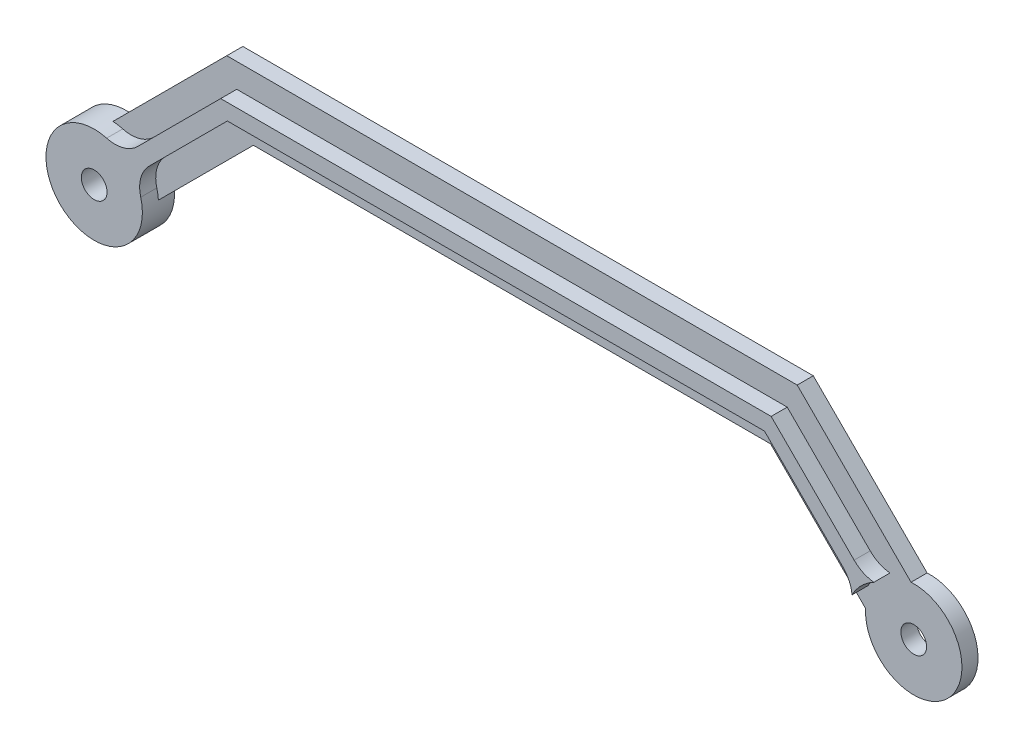
ISO-10303-21;
HEADER;
FILE_DESCRIPTION(('STEP AP214'),'2;1');
FILE_NAME('part.step','',(''),(''),'','','');
FILE_SCHEMA(('AUTOMOTIVE_DESIGN { 1 0 10303 214 1 1 1 1 }'));
ENDSEC;
DATA;
#1=APPLICATION_CONTEXT('core data for automotive mechanical design processes');
#2=APPLICATION_PROTOCOL_DEFINITION('international standard','automotive_design',2000,#1);
#3=PRODUCT_CONTEXT('',#1,'mechanical');
#4=PRODUCT('Part','Part','',(#3));
#5=PRODUCT_RELATED_PRODUCT_CATEGORY('part','',(#4));
#6=PRODUCT_DEFINITION_FORMATION('','',#4);
#7=PRODUCT_DEFINITION_CONTEXT('part definition',#1,'design');
#8=PRODUCT_DEFINITION('design','',#6,#7);
#9=PRODUCT_DEFINITION_SHAPE('','',#8);
#10=(LENGTH_UNIT() NAMED_UNIT(*) SI_UNIT(.MILLI.,.METRE.));
#11=(NAMED_UNIT(*) PLANE_ANGLE_UNIT() SI_UNIT($,.RADIAN.));
#12=(NAMED_UNIT(*) SI_UNIT($,.STERADIAN.) SOLID_ANGLE_UNIT());
#13=UNCERTAINTY_MEASURE_WITH_UNIT(LENGTH_MEASURE(1.E-05),#10,'distance_accuracy_value','');
#14=(GEOMETRIC_REPRESENTATION_CONTEXT(3) GLOBAL_UNCERTAINTY_ASSIGNED_CONTEXT((#13)) GLOBAL_UNIT_ASSIGNED_CONTEXT((#10,
#11,#12)) REPRESENTATION_CONTEXT('',''));
#15=CARTESIAN_POINT('',(0.,0.,0.));
#16=DIRECTION('',(0.,0.,1.));
#17=DIRECTION('',(1.,0.,0.));
#18=AXIS2_PLACEMENT_3D('',#15,#16,#17);
#19=CARTESIAN_POINT('',(196.015609295867,10.8129154012847,4.46390509890252));
#20=DIRECTION('',(0.,0.,-1.));
#21=DIRECTION('',(-1.,0.,0.));
#22=AXIS2_PLACEMENT_3D('',#19,#20,#21);
#23=CYLINDRICAL_SURFACE('',#22,9.);
#24=CARTESIAN_POINT('',(196.015609295867,10.8129154012847,4.46390509890252));
#25=DIRECTION('',(0.,0.,1.));
#26=DIRECTION('',(1.,0.,0.));
#27=AXIS2_PLACEMENT_3D('',#24,#25,#26);
#28=CIRCLE('',#27,9.);
#29=CARTESIAN_POINT('',(187.029552118495,11.3136912044179,4.46390509890252));
#30=VERTEX_POINT('',#29);
#31=CARTESIAN_POINT('',(195.514833492734,19.7989725786565,4.46390509890252));
#32=VERTEX_POINT('',#31);
#33=EDGE_CURVE('E331',#30,#32,#28,.T.);
#34=ORIENTED_EDGE('',*,*,#33,.F.);
#35=DIRECTION('',(0.,0.,-1.));
#36=VECTOR('',#35,1.);
#37=CARTESIAN_POINT('',(187.029552118495,11.3136912044179,4.46390509890252));
#38=LINE('',#37,#36);
#39=CARTESIAN_POINT('',(187.029552118495,11.3136912044179,1.46390509890252));
#40=VERTEX_POINT('',#39);
#41=EDGE_CURVE('E225',#30,#40,#38,.T.);
#42=ORIENTED_EDGE('',*,*,#41,.T.);
#43=CARTESIAN_POINT('',(196.015609295867,10.8129154012847,1.46390509890252));
#44=DIRECTION('',(0.,0.,1.));
#45=DIRECTION('',(-1.,0.,0.));
#46=AXIS2_PLACEMENT_3D('',#43,#44,#45);
#47=CIRCLE('',#46,9.);
#48=CARTESIAN_POINT('',(195.514833492734,19.7989725786565,1.46390509890252));
#49=VERTEX_POINT('',#48);
#50=EDGE_CURVE('E258',#40,#49,#47,.T.);
#51=ORIENTED_EDGE('',*,*,#50,.T.);
#52=DIRECTION('',(0.,0.,-1.));
#53=VECTOR('',#52,1.);
#54=CARTESIAN_POINT('',(195.514833492734,19.7989725786565,4.46390509890252));
#55=LINE('',#54,#53);
#56=EDGE_CURVE('E228',#32,#49,#55,.T.);
#57=ORIENTED_EDGE('',*,*,#56,.F.);
#58=EDGE_LOOP('',(#34,#42,#51,#57));
#59=FACE_BOUND('',#58,.T.);
#60=ADVANCED_FACE('F39',(#59),#23,.T.);
#61=CARTESIAN_POINT('',(196.015609295867,10.8129154012847,4.46390509890252));
#62=DIRECTION('',(0.,0.,-1.));
#63=DIRECTION('',(-1.,0.,0.));
#64=AXIS2_PLACEMENT_3D('',#61,#62,#63);
#65=CYLINDRICAL_SURFACE('',#64,2.4);
#66=CARTESIAN_POINT('',(196.015609295867,10.8129154012847,1.46390509890252));
#67=DIRECTION('',(0.,0.,1.));
#68=DIRECTION('',(1.,0.,0.));
#69=AXIS2_PLACEMENT_3D('',#66,#67,#68);
#70=CIRCLE('',#69,2.4);
#71=CARTESIAN_POINT('',(198.415609295867,10.8129154012847,1.46390509890252));
#72=VERTEX_POINT('',#71);
#73=EDGE_CURVE('E280',#72,#72,#70,.T.);
#74=ORIENTED_EDGE('',*,*,#73,.F.);
#75=EDGE_LOOP('',(#74));
#76=FACE_BOUND('',#75,.T.);
#77=CARTESIAN_POINT('',(196.015609295867,10.8129154012847,4.46390509890252));
#78=DIRECTION('',(0.,0.,1.));
#79=DIRECTION('',(1.,0.,0.));
#80=AXIS2_PLACEMENT_3D('',#77,#78,#79);
#81=CIRCLE('',#80,2.4);
#82=CARTESIAN_POINT('',(198.415609295867,10.8129154012847,4.46390509890252));
#83=VERTEX_POINT('',#82);
#84=EDGE_CURVE('E332',#83,#83,#81,.T.);
#85=ORIENTED_EDGE('',*,*,#84,.T.);
#86=EDGE_LOOP('',(#85));
#87=FACE_BOUND('',#86,.T.);
#88=ADVANCED_FACE('F415',(#76,#87),#65,.F.);
#89=CARTESIAN_POINT('',(196.015609295867,10.8129154012847,4.46390509890252));
#90=DIRECTION('',(0.,0.,-1.));
#91=DIRECTION('',(-1.,0.,0.));
#92=AXIS2_PLACEMENT_3D('',#89,#90,#91);
#93=PLANE('',#92);
#94=DIRECTION('',(0.707106781186551,-0.707106781186544,0.));
#95=VECTOR('',#94,1.);
#96=CARTESIAN_POINT('',(169.29205915731,29.0511841656034,4.46390509890252));
#97=LINE('',#96,#95);
#98=CARTESIAN_POINT('',(169.29205915731,29.0511841656034,4.46390509890252));
#99=VERTEX_POINT('',#98);
#100=EDGE_CURVE('E274',#99,#30,#97,.T.);
#101=ORIENTED_EDGE('',*,*,#100,.T.);
#102=ORIENTED_EDGE('',*,*,#33,.T.);
#103=DIRECTION('',(-0.707106781186552,0.707106781186543,0.));
#104=VECTOR('',#103,1.);
#105=CARTESIAN_POINT('',(195.514833492734,19.7989725786565,4.46390509890252));
#106=LINE('',#105,#104);
#107=CARTESIAN_POINT('',(174.262621905786,41.051184165604,4.46390509890252));
#108=VERTEX_POINT('',#107);
#109=EDGE_CURVE('E272',#32,#108,#106,.T.);
#110=ORIENTED_EDGE('',*,*,#109,.T.);
#111=DIRECTION('',(-1.,0.,0.));
#112=VECTOR('',#111,1.);
#113=CARTESIAN_POINT('',(67.7685966859482,41.051184165604,4.46390509890252));
#114=LINE('',#113,#112);
#115=CARTESIAN_POINT('',(67.7685966859482,41.051184165604,4.46390509890252));
#116=VERTEX_POINT('',#115);
#117=EDGE_CURVE('E270',#108,#116,#114,.T.);
#118=ORIENTED_EDGE('',*,*,#117,.T.);
#119=DIRECTION('',(-0.707106781186551,-0.707106781186544,0.));
#120=VECTOR('',#119,1.);
#121=CARTESIAN_POINT('',(46.5163850990004,19.7989725786565,4.46390509890252));
#122=LINE('',#121,#120);
#123=CARTESIAN_POINT('',(46.5163850990004,19.7989725786565,4.46390509890252));
#124=VERTEX_POINT('',#123);
#125=EDGE_CURVE('E267',#116,#124,#122,.T.);
#126=ORIENTED_EDGE('',*,*,#125,.T.);
#127=CARTESIAN_POINT('',(46.0156092958671,10.8129154012847,4.46390509890252));
#128=DIRECTION('',(0.,0.,1.));
#129=DIRECTION('',(1.,0.,0.));
#130=AXIS2_PLACEMENT_3D('',#127,#128,#129);
#131=CIRCLE('',#130,9.);
#132=CARTESIAN_POINT('',(48.3449807017898,19.5062478378863,4.46390509890252));
#133=VERTEX_POINT('',#132);
#134=EDGE_CURVE('E324',#133,#124,#131,.T.);
#135=ORIENTED_EDGE('',*,*,#134,.F.);
#136=CARTESIAN_POINT('',(49.897894972405,25.3018027956207,4.46390509890252));
#137=DIRECTION('',(0.,0.,-1.));
#138=DIRECTION('',(-1.,0.,0.));
#139=AXIS2_PLACEMENT_3D('',#136,#137,#138);
#140=CIRCLE('',#139,6.);
#141=CARTESIAN_POINT('',(54.1405356595243,21.0591621085014,4.46390509890252));
#142=VERTEX_POINT('',#141);
#143=EDGE_CURVE('E213',#133,#142,#140,.F.);
#144=ORIENTED_EDGE('',*,*,#143,.T.);
#145=DIRECTION('',(-0.707106781186551,-0.707106781186544,0.));
#146=VECTOR('',#145,1.);
#147=CARTESIAN_POINT('',(69.6325577166266,36.5511841656036,4.46390509890252));
#148=LINE('',#147,#146);
#149=CARTESIAN_POINT('',(69.6325577166266,36.5511841656036,4.46390509890252));
#150=VERTEX_POINT('',#149);
#151=EDGE_CURVE('E304',#150,#142,#148,.T.);
#152=ORIENTED_EDGE('',*,*,#151,.F.);
#153=DIRECTION('',(-1.,0.,0.));
#154=VECTOR('',#153,1.);
#155=CARTESIAN_POINT('',(172.398660875107,36.551184165604,4.46390509890252));
#156=LINE('',#155,#154);
#157=CARTESIAN_POINT('',(172.398660875107,36.551184165604,4.46390509890252));
#158=VERTEX_POINT('',#157);
#159=EDGE_CURVE('E306',#158,#150,#156,.T.);
#160=ORIENTED_EDGE('',*,*,#159,.F.);
#161=DIRECTION('',(-0.707106781186552,0.707106781186543,0.));
#162=VECTOR('',#161,1.);
#163=CARTESIAN_POINT('',(192.332852977394,16.616992063317,4.46390509890252));
#164=LINE('',#163,#162);
#165=CARTESIAN_POINT('',(187.89068293221,21.0591621085014,4.46390509890252));
#166=VERTEX_POINT('',#165);
#167=EDGE_CURVE('E308',#166,#158,#164,.T.);
#168=ORIENTED_EDGE('',*,*,#167,.F.);
#169=CARTESIAN_POINT('',(192.133323619329,25.3018027956207,4.46390509890252));
#170=DIRECTION('',(0.,0.,-1.));
#171=DIRECTION('',(-1.,0.,0.));
#172=AXIS2_PLACEMENT_3D('',#169,#170,#171);
#173=CIRCLE('',#172,6.);
#174=CARTESIAN_POINT('',(191.5810135346,19.327277411098,4.46390509890252));
#175=VERTEX_POINT('',#174);
#176=EDGE_CURVE('E211',#166,#175,#173,.F.);
#177=ORIENTED_EDGE('',*,*,#176,.T.);
#178=CARTESIAN_POINT('',(196.015609295867,10.8129154012847,4.46390509890252));
#179=DIRECTION('',(0.,0.,1.));
#180=DIRECTION('',(1.,0.,0.));
#181=AXIS2_PLACEMENT_3D('',#178,#179,#180);
#182=CIRCLE('',#181,9.60000000000002);
#183=CARTESIAN_POINT('',(187.501247286054,15.2475111625517,4.46390509890252));
#184=VERTEX_POINT('',#183);
#185=EDGE_CURVE('E180',#175,#184,#182,.T.);
#186=ORIENTED_EDGE('',*,*,#185,.T.);
#187=CARTESIAN_POINT('',(181.526721901531,14.6952010778224,4.46390509890252));
#188=DIRECTION('',(0.,0.,-1.));
#189=DIRECTION('',(-1.,0.,0.));
#190=AXIS2_PLACEMENT_3D('',#187,#188,#189);
#191=CIRCLE('',#190,6.);
#192=CARTESIAN_POINT('',(185.76936258865,18.9378417649417,4.46390509890252));
#193=VERTEX_POINT('',#192);
#194=EDGE_CURVE('E218',#184,#193,#191,.F.);
#195=ORIENTED_EDGE('',*,*,#194,.T.);
#196=DIRECTION('',(0.707106781186551,-0.707106781186544,0.));
#197=VECTOR('',#196,1.);
#198=CARTESIAN_POINT('',(171.156020187988,33.5511841656034,4.46390509890252));
#199=LINE('',#198,#197);
#200=CARTESIAN_POINT('',(171.156020187988,33.5511841656034,4.46390509890252));
#201=VERTEX_POINT('',#200);
#202=EDGE_CURVE('E296',#201,#193,#199,.T.);
#203=ORIENTED_EDGE('',*,*,#202,.F.);
#204=DIRECTION('',(1.,0.,0.));
#205=VECTOR('',#204,1.);
#206=CARTESIAN_POINT('',(70.8751984037462,33.5511841656039,4.46390509890252));
#207=LINE('',#206,#205);
#208=CARTESIAN_POINT('',(70.8751984037462,33.5511841656039,4.46390509890252));
#209=VERTEX_POINT('',#208);
#210=EDGE_CURVE('E300',#209,#201,#207,.T.);
#211=ORIENTED_EDGE('',*,*,#210,.F.);
#212=DIRECTION('',(0.707106781186551,0.707106781186544,0.));
#213=VECTOR('',#212,1.);
#214=CARTESIAN_POINT('',(51.8196859578995,14.4956717197574,4.46390509890252));
#215=LINE('',#214,#213);
#216=CARTESIAN_POINT('',(56.2618560030839,18.9378417649417,4.46390509890252));
#217=VERTEX_POINT('',#216);
#218=EDGE_CURVE('E302',#217,#209,#215,.T.);
#219=ORIENTED_EDGE('',*,*,#218,.F.);
#220=CARTESIAN_POINT('',(60.5044966902031,14.6952010778224,4.46390509890252));
#221=DIRECTION('',(0.,0.,-1.));
#222=DIRECTION('',(-1.,0.,0.));
#223=AXIS2_PLACEMENT_3D('',#220,#221,#222);
#224=CIRCLE('',#223,6.);
#225=CARTESIAN_POINT('',(54.7089417324687,13.1422868072073,4.46390509890252));
#226=VERTEX_POINT('',#225);
#227=EDGE_CURVE('E220',#217,#226,#224,.F.);
#228=ORIENTED_EDGE('',*,*,#227,.T.);
#229=CARTESIAN_POINT('',(55.001666473239,11.3136912044179,4.46390509890252));
#230=VERTEX_POINT('',#229);
#231=EDGE_CURVE('E321',#230,#226,#131,.T.);
#232=ORIENTED_EDGE('',*,*,#231,.F.);
#233=DIRECTION('',(0.707106781186551,0.707106781186544,0.));
#234=VECTOR('',#233,1.);
#235=CARTESIAN_POINT('',(72.7391594344246,29.0511841656034,4.46390509890252));
#236=LINE('',#235,#234);
#237=CARTESIAN_POINT('',(72.7391594344246,29.0511841656034,4.46390509890252));
#238=VERTEX_POINT('',#237);
#239=EDGE_CURVE('E246',#230,#238,#236,.T.);
#240=ORIENTED_EDGE('',*,*,#239,.T.);
#241=DIRECTION('',(1.,0.,0.));
#242=VECTOR('',#241,1.);
#243=CARTESIAN_POINT('',(72.7391594344246,29.0511841656034,4.46390509890252));
#244=LINE('',#243,#242);
#245=EDGE_CURVE('E249',#238,#99,#244,.T.);
#246=ORIENTED_EDGE('',*,*,#245,.T.);
#247=EDGE_LOOP('',(#101,#102,#110,#118,#126,#135,#144,#152,#160,#168,#177,#186,#195,#203,#211,
#219,#228,#232,#240,#246));
#248=FACE_BOUND('',#247,.T.);
#249=ORIENTED_EDGE('',*,*,#84,.F.);
#250=EDGE_LOOP('',(#249));
#251=FACE_BOUND('',#250,.T.);
#252=ADVANCED_FACE('F338',(#248,#251),#93,.F.);
#253=CARTESIAN_POINT('',(192.332852977394,16.616992063317,7.46390509890252));
#254=DIRECTION('',(-0.707106781186543,-0.707106781186552,0.));
#255=DIRECTION('',(0.707106781186552,-0.707106781186543,0.));
#256=AXIS2_PLACEMENT_3D('',#253,#254,#255);
#257=PLANE('',#256);
#258=DIRECTION('',(-0.707106781186552,0.707106781186543,0.));
#259=VECTOR('',#258,1.);
#260=CARTESIAN_POINT('',(192.332852977394,16.616992063317,7.46390509890252));
#261=LINE('',#260,#259);
#262=CARTESIAN_POINT('',(187.89068293221,21.0591621085014,7.46390509890252));
#263=VERTEX_POINT('',#262);
#264=CARTESIAN_POINT('',(172.398660875107,36.551184165604,7.46390509890252));
#265=VERTEX_POINT('',#264);
#266=EDGE_CURVE('E299',#263,#265,#261,.T.);
#267=ORIENTED_EDGE('',*,*,#266,.F.);
#268=DIRECTION('',(0.,0.,1.));
#269=VECTOR('',#268,1.);
#270=CARTESIAN_POINT('',(187.89068293221,21.0591621085014,4.46390509890252));
#271=LINE('',#270,#269);
#272=EDGE_CURVE('E196',#263,#166,#271,.F.);
#273=ORIENTED_EDGE('',*,*,#272,.T.);
#274=ORIENTED_EDGE('',*,*,#167,.T.);
#275=DIRECTION('',(0.,0.,-1.));
#276=VECTOR('',#275,1.);
#277=CARTESIAN_POINT('',(172.398660875107,36.551184165604,7.46390509890252));
#278=LINE('',#277,#276);
#279=EDGE_CURVE('E283',#265,#158,#278,.T.);
#280=ORIENTED_EDGE('',*,*,#279,.F.);
#281=EDGE_LOOP('',(#267,#273,#274,#280));
#282=FACE_BOUND('',#281,.T.);
#283=ADVANCED_FACE('F446',(#282),#257,.F.);
#284=CARTESIAN_POINT('',(171.156020187988,33.5511841656034,7.46390509890252));
#285=DIRECTION('',(0.707106781186544,0.707106781186551,0.));
#286=DIRECTION('',(-0.707106781186551,0.707106781186544,0.));
#287=AXIS2_PLACEMENT_3D('',#284,#285,#286);
#288=PLANE('',#287);
#289=ORIENTED_EDGE('',*,*,#202,.T.);
#290=DIRECTION('',(0.,0.,1.));
#291=VECTOR('',#290,1.);
#292=CARTESIAN_POINT('',(185.76936258865,18.9378417649417,7.46390509890252));
#293=LINE('',#292,#291);
#294=CARTESIAN_POINT('',(185.76936258865,18.9378417649417,7.46390509890252));
#295=VERTEX_POINT('',#294);
#296=EDGE_CURVE('E216',#193,#295,#293,.T.);
#297=ORIENTED_EDGE('',*,*,#296,.T.);
#298=DIRECTION('',(0.707106781186551,-0.707106781186544,0.));
#299=VECTOR('',#298,1.);
#300=CARTESIAN_POINT('',(171.156020187988,33.5511841656034,7.46390509890252));
#301=LINE('',#300,#299);
#302=CARTESIAN_POINT('',(171.156020187988,33.5511841656034,7.46390509890252));
#303=VERTEX_POINT('',#302);
#304=EDGE_CURVE('E295',#303,#295,#301,.T.);
#305=ORIENTED_EDGE('',*,*,#304,.F.);
#306=DIRECTION('',(0.,0.,-1.));
#307=VECTOR('',#306,1.);
#308=CARTESIAN_POINT('',(171.156020187988,33.5511841656034,7.46390509890252));
#309=LINE('',#308,#307);
#310=EDGE_CURVE('E292',#303,#201,#309,.T.);
#311=ORIENTED_EDGE('',*,*,#310,.T.);
#312=EDGE_LOOP('',(#289,#297,#305,#311));
#313=FACE_BOUND('',#312,.T.);
#314=ADVANCED_FACE('F347',(#313),#288,.F.);
#315=CARTESIAN_POINT('',(69.6325577166266,36.5511841656036,7.46390509890252));
#316=DIRECTION('',(0.707106781186544,-0.707106781186551,0.));
#317=DIRECTION('',(0.707106781186551,0.707106781186544,0.));
#318=AXIS2_PLACEMENT_3D('',#315,#316,#317);
#319=PLANE('',#318);
#320=ORIENTED_EDGE('',*,*,#151,.T.);
#321=DIRECTION('',(0.,0.,1.));
#322=VECTOR('',#321,1.);
#323=CARTESIAN_POINT('',(54.1405356595243,21.0591621085014,7.46390509890252));
#324=LINE('',#323,#322);
#325=CARTESIAN_POINT('',(54.1405356595243,21.0591621085014,7.46390509890252));
#326=VERTEX_POINT('',#325);
#327=EDGE_CURVE('E61',#142,#326,#324,.T.);
#328=ORIENTED_EDGE('',*,*,#327,.T.);
#329=DIRECTION('',(-0.707106781186551,-0.707106781186544,0.));
#330=VECTOR('',#329,1.);
#331=CARTESIAN_POINT('',(69.6325577166266,36.5511841656036,7.46390509890252));
#332=LINE('',#331,#330);
#333=CARTESIAN_POINT('',(69.6325577166266,36.5511841656036,7.46390509890252));
#334=VERTEX_POINT('',#333);
#335=EDGE_CURVE('E316',#334,#326,#332,.T.);
#336=ORIENTED_EDGE('',*,*,#335,.F.);
#337=DIRECTION('',(0.,0.,-1.));
#338=VECTOR('',#337,1.);
#339=CARTESIAN_POINT('',(69.6325577166266,36.5511841656036,7.46390509890252));
#340=LINE('',#339,#338);
#341=EDGE_CURVE('E286',#334,#150,#340,.T.);
#342=ORIENTED_EDGE('',*,*,#341,.T.);
#343=EDGE_LOOP('',(#320,#328,#336,#342));
#344=FACE_BOUND('',#343,.T.);
#345=ADVANCED_FACE('F445',(#344),#319,.F.);
#346=CARTESIAN_POINT('',(51.8196859578995,14.4956717197574,7.46390509890252));
#347=DIRECTION('',(-0.707106781186544,0.707106781186551,0.));
#348=DIRECTION('',(-0.707106781186551,-0.707106781186544,0.));
#349=AXIS2_PLACEMENT_3D('',#346,#347,#348);
#350=PLANE('',#349);
#351=DIRECTION('',(0.707106781186551,0.707106781186544,0.));
#352=VECTOR('',#351,1.);
#353=CARTESIAN_POINT('',(51.8196859578995,14.4956717197574,7.46390509890252));
#354=LINE('',#353,#352);
#355=CARTESIAN_POINT('',(56.2618560030839,18.9378417649417,7.46390509890252));
#356=VERTEX_POINT('',#355);
#357=CARTESIAN_POINT('',(70.8751984037462,33.5511841656039,7.46390509890252));
#358=VERTEX_POINT('',#357);
#359=EDGE_CURVE('E314',#356,#358,#354,.T.);
#360=ORIENTED_EDGE('',*,*,#359,.F.);
#361=DIRECTION('',(0.,0.,1.));
#362=VECTOR('',#361,1.);
#363=CARTESIAN_POINT('',(56.2618560030839,18.9378417649417,4.46390509890252));
#364=LINE('',#363,#362);
#365=EDGE_CURVE('E200',#356,#217,#364,.F.);
#366=ORIENTED_EDGE('',*,*,#365,.T.);
#367=ORIENTED_EDGE('',*,*,#218,.T.);
#368=DIRECTION('',(0.,0.,-1.));
#369=VECTOR('',#368,1.);
#370=CARTESIAN_POINT('',(70.8751984037462,33.5511841656039,7.46390509890252));
#371=LINE('',#370,#369);
#372=EDGE_CURVE('E289',#358,#209,#371,.T.);
#373=ORIENTED_EDGE('',*,*,#372,.F.);
#374=EDGE_LOOP('',(#360,#366,#367,#373));
#375=FACE_BOUND('',#374,.T.);
#376=ADVANCED_FACE('F450',(#375),#350,.F.);
#377=CARTESIAN_POINT('',(196.015609295867,10.8129154012847,1.46390509890252));
#378=DIRECTION('',(0.,0.,-1.));
#379=DIRECTION('',(-1.,0.,0.));
#380=AXIS2_PLACEMENT_3D('',#377,#378,#379);
#381=PLANE('',#380);
#382=CARTESIAN_POINT('',(46.0156092958671,10.8129154012847,1.46390509890252));
#383=DIRECTION('',(0.,0.,1.));
#384=DIRECTION('',(1.,0.,0.));
#385=AXIS2_PLACEMENT_3D('',#382,#383,#384);
#386=CIRCLE('',#385,2.4);
#387=CARTESIAN_POINT('',(48.4156092958671,10.8129154012847,1.46390509890252));
#388=VERTEX_POINT('',#387);
#389=EDGE_CURVE('E265',#388,#388,#386,.T.);
#390=ORIENTED_EDGE('',*,*,#389,.T.);
#391=EDGE_LOOP('',(#390));
#392=FACE_BOUND('',#391,.T.);
#393=DIRECTION('',(1.,0.,0.));
#394=VECTOR('',#393,1.);
#395=CARTESIAN_POINT('',(72.7391594344246,29.0511841656034,1.46390509890252));
#396=LINE('',#395,#394);
#397=CARTESIAN_POINT('',(72.7391594344246,29.0511841656034,1.46390509890252));
#398=VERTEX_POINT('',#397);
#399=CARTESIAN_POINT('',(169.29205915731,29.0511841656034,1.46390509890252));
#400=VERTEX_POINT('',#399);
#401=EDGE_CURVE('E262',#398,#400,#396,.T.);
#402=ORIENTED_EDGE('',*,*,#401,.F.);
#403=DIRECTION('',(0.707106781186551,0.707106781186544,0.));
#404=VECTOR('',#403,1.);
#405=CARTESIAN_POINT('',(72.7391594344246,29.0511841656034,1.46390509890252));
#406=LINE('',#405,#404);
#407=CARTESIAN_POINT('',(55.001666473239,11.3136912044179,1.46390509890252));
#408=VERTEX_POINT('',#407);
#409=EDGE_CURVE('E247',#408,#398,#406,.T.);
#410=ORIENTED_EDGE('',*,*,#409,.F.);
#411=CARTESIAN_POINT('',(46.0156092958671,10.8129154012847,1.46390509890252));
#412=DIRECTION('',(0.,0.,1.));
#413=DIRECTION('',(1.,0.,0.));
#414=AXIS2_PLACEMENT_3D('',#411,#412,#413);
#415=CIRCLE('',#414,9.);
#416=CARTESIAN_POINT('',(46.5163850990004,19.7989725786565,1.46390509890252));
#417=VERTEX_POINT('',#416);
#418=EDGE_CURVE('E250',#417,#408,#415,.T.);
#419=ORIENTED_EDGE('',*,*,#418,.F.);
#420=DIRECTION('',(-0.707106781186551,-0.707106781186544,0.));
#421=VECTOR('',#420,1.);
#422=CARTESIAN_POINT('',(46.5163850990004,19.7989725786565,1.46390509890252));
#423=LINE('',#422,#421);
#424=CARTESIAN_POINT('',(67.7685966859482,41.051184165604,1.46390509890252));
#425=VERTEX_POINT('',#424);
#426=EDGE_CURVE('E252',#425,#417,#423,.T.);
#427=ORIENTED_EDGE('',*,*,#426,.F.);
#428=DIRECTION('',(-1.,0.,0.));
#429=VECTOR('',#428,1.);
#430=CARTESIAN_POINT('',(67.7685966859482,41.051184165604,1.46390509890252));
#431=LINE('',#430,#429);
#432=CARTESIAN_POINT('',(174.262621905786,41.051184165604,1.46390509890252));
#433=VERTEX_POINT('',#432);
#434=EDGE_CURVE('E254',#433,#425,#431,.T.);
#435=ORIENTED_EDGE('',*,*,#434,.F.);
#436=DIRECTION('',(-0.707106781186552,0.707106781186543,0.));
#437=VECTOR('',#436,1.);
#438=CARTESIAN_POINT('',(195.514833492734,19.7989725786565,1.46390509890252));
#439=LINE('',#438,#437);
#440=EDGE_CURVE('E256',#49,#433,#439,.T.);
#441=ORIENTED_EDGE('',*,*,#440,.F.);
#442=ORIENTED_EDGE('',*,*,#50,.F.);
#443=DIRECTION('',(0.707106781186551,-0.707106781186544,0.));
#444=VECTOR('',#443,1.);
#445=CARTESIAN_POINT('',(169.29205915731,29.0511841656034,1.46390509890252));
#446=LINE('',#445,#444);
#447=EDGE_CURVE('E260',#400,#40,#446,.T.);
#448=ORIENTED_EDGE('',*,*,#447,.F.);
#449=EDGE_LOOP('',(#402,#410,#419,#427,#435,#441,#442,#448));
#450=FACE_BOUND('',#449,.T.);
#451=ORIENTED_EDGE('',*,*,#73,.T.);
#452=EDGE_LOOP('',(#451));
#453=FACE_BOUND('',#452,.T.);
#454=ADVANCED_FACE('F381',(#392,#450,#453),#381,.T.);
#455=CARTESIAN_POINT('',(72.7391594344246,29.0511841656034,4.46390509890252));
#456=DIRECTION('',(0.,1.,0.));
#457=DIRECTION('',(-1.,0.,0.));
#458=AXIS2_PLACEMENT_3D('',#455,#456,#457);
#459=PLANE('',#458);
#460=ORIENTED_EDGE('',*,*,#401,.T.);
#461=DIRECTION('',(0.,0.,-1.));
#462=VECTOR('',#461,1.);
#463=CARTESIAN_POINT('',(169.29205915731,29.0511841656034,4.46390509890252));
#464=LINE('',#463,#462);
#465=EDGE_CURVE('E222',#99,#400,#464,.T.);
#466=ORIENTED_EDGE('',*,*,#465,.F.);
#467=ORIENTED_EDGE('',*,*,#245,.F.);
#468=DIRECTION('',(0.,0.,-1.));
#469=VECTOR('',#468,1.);
#470=CARTESIAN_POINT('',(72.7391594344246,29.0511841656034,4.46390509890252));
#471=LINE('',#470,#469);
#472=EDGE_CURVE('E243',#238,#398,#471,.T.);
#473=ORIENTED_EDGE('',*,*,#472,.T.);
#474=EDGE_LOOP('',(#460,#466,#467,#473));
#475=FACE_BOUND('',#474,.T.);
#476=ADVANCED_FACE('F390',(#475),#459,.F.);
#477=CARTESIAN_POINT('',(169.29205915731,29.0511841656034,4.46390509890252));
#478=DIRECTION('',(0.707106781186544,0.707106781186551,0.));
#479=DIRECTION('',(-0.707106781186551,0.707106781186544,0.));
#480=AXIS2_PLACEMENT_3D('',#477,#478,#479);
#481=PLANE('',#480);
#482=ORIENTED_EDGE('',*,*,#447,.T.);
#483=ORIENTED_EDGE('',*,*,#41,.F.);
#484=ORIENTED_EDGE('',*,*,#100,.F.);
#485=ORIENTED_EDGE('',*,*,#465,.T.);
#486=EDGE_LOOP('',(#482,#483,#484,#485));
#487=FACE_BOUND('',#486,.T.);
#488=ADVANCED_FACE('F399',(#487),#481,.F.);
#489=CARTESIAN_POINT('',(195.514833492734,19.7989725786565,4.46390509890252));
#490=DIRECTION('',(-0.707106781186543,-0.707106781186552,0.));
#491=DIRECTION('',(0.707106781186552,-0.707106781186543,0.));
#492=AXIS2_PLACEMENT_3D('',#489,#490,#491);
#493=PLANE('',#492);
#494=ORIENTED_EDGE('',*,*,#440,.T.);
#495=DIRECTION('',(0.,0.,-1.));
#496=VECTOR('',#495,1.);
#497=CARTESIAN_POINT('',(174.262621905786,41.051184165604,4.46390509890252));
#498=LINE('',#497,#496);
#499=EDGE_CURVE('E231',#108,#433,#498,.T.);
#500=ORIENTED_EDGE('',*,*,#499,.F.);
#501=ORIENTED_EDGE('',*,*,#109,.F.);
#502=ORIENTED_EDGE('',*,*,#56,.T.);
#503=EDGE_LOOP('',(#494,#500,#501,#502));
#504=FACE_BOUND('',#503,.T.);
#505=ADVANCED_FACE('F402',(#504),#493,.F.);
#506=CARTESIAN_POINT('',(67.7685966859482,41.051184165604,4.46390509890252));
#507=DIRECTION('',(0.,-1.,0.));
#508=DIRECTION('',(0.,0.,-1.));
#509=AXIS2_PLACEMENT_3D('',#506,#507,#508);
#510=PLANE('',#509);
#511=ORIENTED_EDGE('',*,*,#434,.T.);
#512=DIRECTION('',(0.,0.,-1.));
#513=VECTOR('',#512,1.);
#514=CARTESIAN_POINT('',(67.7685966859482,41.051184165604,4.46390509890252));
#515=LINE('',#514,#513);
#516=EDGE_CURVE('E234',#116,#425,#515,.T.);
#517=ORIENTED_EDGE('',*,*,#516,.F.);
#518=ORIENTED_EDGE('',*,*,#117,.F.);
#519=ORIENTED_EDGE('',*,*,#499,.T.);
#520=EDGE_LOOP('',(#511,#517,#518,#519));
#521=FACE_BOUND('',#520,.T.);
#522=ADVANCED_FACE('F405',(#521),#510,.F.);
#523=CARTESIAN_POINT('',(46.5163850990004,19.7989725786565,4.46390509890252));
#524=DIRECTION('',(0.707106781186544,-0.707106781186551,0.));
#525=DIRECTION('',(0.707106781186551,0.707106781186544,0.));
#526=AXIS2_PLACEMENT_3D('',#523,#524,#525);
#527=PLANE('',#526);
#528=ORIENTED_EDGE('',*,*,#426,.T.);
#529=DIRECTION('',(0.,0.,-1.));
#530=VECTOR('',#529,1.);
#531=CARTESIAN_POINT('',(46.5163850990004,19.7989725786565,4.46390509890252));
#532=LINE('',#531,#530);
#533=EDGE_CURVE('E237',#124,#417,#532,.T.);
#534=ORIENTED_EDGE('',*,*,#533,.F.);
#535=ORIENTED_EDGE('',*,*,#125,.F.);
#536=ORIENTED_EDGE('',*,*,#516,.T.);
#537=EDGE_LOOP('',(#528,#534,#535,#536));
#538=FACE_BOUND('',#537,.T.);
#539=ADVANCED_FACE('F375',(#538),#527,.F.);
#540=CARTESIAN_POINT('',(46.0156092958671,10.8129154012847,4.46390509890252));
#541=DIRECTION('',(0.,0.,-1.));
#542=DIRECTION('',(-1.,0.,0.));
#543=AXIS2_PLACEMENT_3D('',#540,#541,#542);
#544=CYLINDRICAL_SURFACE('',#543,9.);
#545=CARTESIAN_POINT('',(46.0156092958671,10.8129154012847,7.46390509890252));
#546=DIRECTION('',(0.,0.,1.));
#547=DIRECTION('',(1.,0.,0.));
#548=AXIS2_PLACEMENT_3D('',#545,#546,#547);
#549=CIRCLE('',#548,9.);
#550=CARTESIAN_POINT('',(48.3449807017898,19.5062478378863,7.46390509890252));
#551=VERTEX_POINT('',#550);
#552=CARTESIAN_POINT('',(54.7089417324687,13.1422868072073,7.46390509890252));
#553=VERTEX_POINT('',#552);
#554=EDGE_CURVE('E310',#551,#553,#549,.T.);
#555=ORIENTED_EDGE('',*,*,#554,.F.);
#556=DIRECTION('',(0.,0.,-1.));
#557=VECTOR('',#556,1.);
#558=CARTESIAN_POINT('',(48.3449807017898,19.5062478378863,4.46390509890252));
#559=LINE('',#558,#557);
#560=EDGE_CURVE('E205',#551,#133,#559,.T.);
#561=ORIENTED_EDGE('',*,*,#560,.T.);
#562=ORIENTED_EDGE('',*,*,#134,.T.);
#563=ORIENTED_EDGE('',*,*,#533,.T.);
#564=ORIENTED_EDGE('',*,*,#418,.T.);
#565=DIRECTION('',(0.,0.,-1.));
#566=VECTOR('',#565,1.);
#567=CARTESIAN_POINT('',(55.001666473239,11.3136912044179,4.46390509890252));
#568=LINE('',#567,#566);
#569=EDGE_CURVE('E240',#230,#408,#568,.T.);
#570=ORIENTED_EDGE('',*,*,#569,.F.);
#571=ORIENTED_EDGE('',*,*,#231,.T.);
#572=DIRECTION('',(0.,0.,-1.));
#573=VECTOR('',#572,1.);
#574=CARTESIAN_POINT('',(54.7089417324687,13.1422868072073,4.46390509890252));
#575=LINE('',#574,#573);
#576=EDGE_CURVE('E208',#226,#553,#575,.F.);
#577=ORIENTED_EDGE('',*,*,#576,.T.);
#578=EDGE_LOOP('',(#555,#561,#562,#563,#564,#570,#571,#577));
#579=FACE_BOUND('',#578,.T.);
#580=ADVANCED_FACE('F362',(#579),#544,.T.);
#581=CARTESIAN_POINT('',(72.7391594344246,29.0511841656034,4.46390509890252));
#582=DIRECTION('',(-0.707106781186544,0.707106781186551,0.));
#583=DIRECTION('',(-0.707106781186551,-0.707106781186544,0.));
#584=AXIS2_PLACEMENT_3D('',#581,#582,#583);
#585=PLANE('',#584);
#586=ORIENTED_EDGE('',*,*,#409,.T.);
#587=ORIENTED_EDGE('',*,*,#472,.F.);
#588=ORIENTED_EDGE('',*,*,#239,.F.);
#589=ORIENTED_EDGE('',*,*,#569,.T.);
#590=EDGE_LOOP('',(#586,#587,#588,#589));
#591=FACE_BOUND('',#590,.T.);
#592=ADVANCED_FACE('F386',(#591),#585,.F.);
#593=CARTESIAN_POINT('',(46.0156092958671,10.8129154012847,4.46390509890252));
#594=DIRECTION('',(0.,0.,-1.));
#595=DIRECTION('',(-1.,0.,0.));
#596=AXIS2_PLACEMENT_3D('',#593,#594,#595);
#597=CYLINDRICAL_SURFACE('',#596,2.4);
#598=ORIENTED_EDGE('',*,*,#389,.F.);
#599=EDGE_LOOP('',(#598));
#600=FACE_BOUND('',#599,.T.);
#601=CARTESIAN_POINT('',(46.0156092958671,10.8129154012847,7.46390509890252));
#602=DIRECTION('',(0.,0.,1.));
#603=DIRECTION('',(1.,0.,0.));
#604=AXIS2_PLACEMENT_3D('',#601,#602,#603);
#605=CIRCLE('',#604,2.4);
#606=CARTESIAN_POINT('',(48.4156092958671,10.8129154012847,7.46390509890252));
#607=VERTEX_POINT('',#606);
#608=EDGE_CURVE('E326',#607,#607,#605,.T.);
#609=ORIENTED_EDGE('',*,*,#608,.T.);
#610=EDGE_LOOP('',(#609));
#611=FACE_BOUND('',#610,.T.);
#612=ADVANCED_FACE('F457',(#600,#611),#597,.F.);
#613=CARTESIAN_POINT('',(172.398660875107,36.551184165604,7.46390509890252));
#614=DIRECTION('',(0.,-1.,0.));
#615=DIRECTION('',(1.,0.,0.));
#616=AXIS2_PLACEMENT_3D('',#613,#614,#615);
#617=PLANE('',#616);
#618=ORIENTED_EDGE('',*,*,#159,.T.);
#619=ORIENTED_EDGE('',*,*,#341,.F.);
#620=DIRECTION('',(-1.,0.,0.));
#621=VECTOR('',#620,1.);
#622=CARTESIAN_POINT('',(172.398660875107,36.551184165604,7.46390509890252));
#623=LINE('',#622,#621);
#624=EDGE_CURVE('E318',#265,#334,#623,.T.);
#625=ORIENTED_EDGE('',*,*,#624,.F.);
#626=ORIENTED_EDGE('',*,*,#279,.T.);
#627=EDGE_LOOP('',(#618,#619,#625,#626));
#628=FACE_BOUND('',#627,.T.);
#629=ADVANCED_FACE('F449',(#628),#617,.F.);
#630=CARTESIAN_POINT('',(70.8751984037462,33.5511841656039,7.46390509890252));
#631=DIRECTION('',(0.,1.,0.));
#632=DIRECTION('',(-1.,0.,0.));
#633=AXIS2_PLACEMENT_3D('',#630,#631,#632);
#634=PLANE('',#633);
#635=ORIENTED_EDGE('',*,*,#210,.T.);
#636=ORIENTED_EDGE('',*,*,#310,.F.);
#637=DIRECTION('',(1.,0.,0.));
#638=VECTOR('',#637,1.);
#639=CARTESIAN_POINT('',(70.8751984037462,33.5511841656039,7.46390509890252));
#640=LINE('',#639,#638);
#641=EDGE_CURVE('E312',#358,#303,#640,.T.);
#642=ORIENTED_EDGE('',*,*,#641,.F.);
#643=ORIENTED_EDGE('',*,*,#372,.T.);
#644=EDGE_LOOP('',(#635,#636,#642,#643));
#645=FACE_BOUND('',#644,.T.);
#646=ADVANCED_FACE('F352',(#645),#634,.F.);
#647=CARTESIAN_POINT('',(46.0156092958671,10.8129154012847,7.46390509890252));
#648=DIRECTION('',(0.,0.,1.));
#649=DIRECTION('',(1.,0.,0.));
#650=AXIS2_PLACEMENT_3D('',#647,#648,#649);
#651=PLANE('',#650);
#652=CARTESIAN_POINT('',(196.015609295867,10.8129154012847,7.46390509890252));
#653=DIRECTION('',(0.,0.,1.));
#654=DIRECTION('',(1.,0.,0.));
#655=AXIS2_PLACEMENT_3D('',#652,#653,#654);
#656=CIRCLE('',#655,9.60000000000002);
#657=CARTESIAN_POINT('',(191.5810135346,19.327277411098,7.46390509890252));
#658=VERTEX_POINT('',#657);
#659=CARTESIAN_POINT('',(187.501247286054,15.2475111625517,7.46390509890252));
#660=VERTEX_POINT('',#659);
#661=EDGE_CURVE('E177',#658,#660,#656,.T.);
#662=ORIENTED_EDGE('',*,*,#661,.F.);
#663=CARTESIAN_POINT('',(192.133323619329,25.3018027956207,7.46390509890252));
#664=DIRECTION('',(0.,0.,1.));
#665=DIRECTION('',(1.,0.,0.));
#666=AXIS2_PLACEMENT_3D('',#663,#664,#665);
#667=CIRCLE('',#666,6.);
#668=EDGE_CURVE('E188',#658,#263,#667,.F.);
#669=ORIENTED_EDGE('',*,*,#668,.T.);
#670=ORIENTED_EDGE('',*,*,#266,.T.);
#671=ORIENTED_EDGE('',*,*,#624,.T.);
#672=ORIENTED_EDGE('',*,*,#335,.T.);
#673=CARTESIAN_POINT('',(49.897894972405,25.3018027956207,7.46390509890252));
#674=DIRECTION('',(0.,0.,1.));
#675=DIRECTION('',(1.,0.,0.));
#676=AXIS2_PLACEMENT_3D('',#673,#674,#675);
#677=CIRCLE('',#676,6.);
#678=EDGE_CURVE('E197',#326,#551,#677,.F.);
#679=ORIENTED_EDGE('',*,*,#678,.T.);
#680=ORIENTED_EDGE('',*,*,#554,.T.);
#681=CARTESIAN_POINT('',(60.5044966902031,14.6952010778224,7.46390509890252));
#682=DIRECTION('',(0.,0.,1.));
#683=DIRECTION('',(1.,0.,0.));
#684=AXIS2_PLACEMENT_3D('',#681,#682,#683);
#685=CIRCLE('',#684,6.);
#686=EDGE_CURVE('E47',#553,#356,#685,.F.);
#687=ORIENTED_EDGE('',*,*,#686,.T.);
#688=ORIENTED_EDGE('',*,*,#359,.T.);
#689=ORIENTED_EDGE('',*,*,#641,.T.);
#690=ORIENTED_EDGE('',*,*,#304,.T.);
#691=CARTESIAN_POINT('',(181.526721901531,14.6952010778224,7.46390509890252));
#692=DIRECTION('',(0.,0.,1.));
#693=DIRECTION('',(1.,0.,0.));
#694=AXIS2_PLACEMENT_3D('',#691,#692,#693);
#695=CIRCLE('',#694,6.);
#696=EDGE_CURVE('E192',#295,#660,#695,.F.);
#697=ORIENTED_EDGE('',*,*,#696,.T.);
#698=EDGE_LOOP('',(#662,#669,#670,#671,#672,#679,#680,#687,#688,#689,#690,#697));
#699=FACE_BOUND('',#698,.T.);
#700=ORIENTED_EDGE('',*,*,#608,.F.);
#701=EDGE_LOOP('',(#700));
#702=FACE_BOUND('',#701,.T.);
#703=ADVANCED_FACE('F186',(#699,#702),#651,.T.);
#704=CARTESIAN_POINT('',(181.526721901531,14.6952010778224,4.46390509890252));
#705=DIRECTION('',(0.,0.,-1.));
#706=DIRECTION('',(-1.,0.,0.));
#707=AXIS2_PLACEMENT_3D('',#704,#705,#706);
#708=CYLINDRICAL_SURFACE('',#707,6.);
#709=ORIENTED_EDGE('',*,*,#194,.F.);
#710=DIRECTION('',(0.,0.,1.));
#711=VECTOR('',#710,1.);
#712=CARTESIAN_POINT('',(187.501247286054,15.2475111625517,5.96390509890252));
#713=LINE('',#712,#711);
#714=EDGE_CURVE('E329',#184,#660,#713,.T.);
#715=ORIENTED_EDGE('',*,*,#714,.T.);
#716=ORIENTED_EDGE('',*,*,#696,.F.);
#717=ORIENTED_EDGE('',*,*,#296,.F.);
#718=EDGE_LOOP('',(#709,#715,#716,#717));
#719=FACE_BOUND('',#718,.T.);
#720=ADVANCED_FACE('F344',(#719),#708,.F.);
#721=CARTESIAN_POINT('',(192.133323619329,25.3018027956207,4.46390509890252));
#722=DIRECTION('',(0.,0.,-1.));
#723=DIRECTION('',(-1.,0.,0.));
#724=AXIS2_PLACEMENT_3D('',#721,#722,#723);
#725=CYLINDRICAL_SURFACE('',#724,6.);
#726=ORIENTED_EDGE('',*,*,#668,.F.);
#727=DIRECTION('',(0.,0.,1.));
#728=VECTOR('',#727,1.);
#729=CARTESIAN_POINT('',(191.5810135346,19.327277411098,5.96390509890252));
#730=LINE('',#729,#728);
#731=EDGE_CURVE('E11',#658,#175,#730,.F.);
#732=ORIENTED_EDGE('',*,*,#731,.T.);
#733=ORIENTED_EDGE('',*,*,#176,.F.);
#734=ORIENTED_EDGE('',*,*,#272,.F.);
#735=EDGE_LOOP('',(#726,#732,#733,#734));
#736=FACE_BOUND('',#735,.T.);
#737=ADVANCED_FACE('F195',(#736),#725,.F.);
#738=CARTESIAN_POINT('',(49.897894972405,25.3018027956207,4.46390509890252));
#739=DIRECTION('',(0.,0.,-1.));
#740=DIRECTION('',(-1.,0.,0.));
#741=AXIS2_PLACEMENT_3D('',#738,#739,#740);
#742=CYLINDRICAL_SURFACE('',#741,6.);
#743=ORIENTED_EDGE('',*,*,#678,.F.);
#744=ORIENTED_EDGE('',*,*,#327,.F.);
#745=ORIENTED_EDGE('',*,*,#143,.F.);
#746=ORIENTED_EDGE('',*,*,#560,.F.);
#747=EDGE_LOOP('',(#743,#744,#745,#746));
#748=FACE_BOUND('',#747,.T.);
#749=ADVANCED_FACE('F367',(#748),#742,.F.);
#750=CARTESIAN_POINT('',(60.5044966902031,14.6952010778224,4.46390509890252));
#751=DIRECTION('',(0.,0.,-1.));
#752=DIRECTION('',(-1.,0.,0.));
#753=AXIS2_PLACEMENT_3D('',#750,#751,#752);
#754=CYLINDRICAL_SURFACE('',#753,6.);
#755=ORIENTED_EDGE('',*,*,#227,.F.);
#756=ORIENTED_EDGE('',*,*,#365,.F.);
#757=ORIENTED_EDGE('',*,*,#686,.F.);
#758=ORIENTED_EDGE('',*,*,#576,.F.);
#759=EDGE_LOOP('',(#755,#756,#757,#758));
#760=FACE_BOUND('',#759,.T.);
#761=ADVANCED_FACE('F41',(#760),#754,.F.);
#762=CARTESIAN_POINT('',(196.015609295867,10.8129154012847,4.46390509890252));
#763=DIRECTION('',(0.,0.,1.));
#764=DIRECTION('',(1.,0.,0.));
#765=AXIS2_PLACEMENT_3D('',#762,#763,#764);
#766=CYLINDRICAL_SURFACE('',#765,9.60000000000002);
#767=ORIENTED_EDGE('',*,*,#185,.F.);
#768=ORIENTED_EDGE('',*,*,#731,.F.);
#769=ORIENTED_EDGE('',*,*,#661,.T.);
#770=ORIENTED_EDGE('',*,*,#714,.F.);
#771=EDGE_LOOP('',(#767,#768,#769,#770));
#772=FACE_BOUND('',#771,.T.);
#773=ADVANCED_FACE('F176',(#772),#766,.F.);
#774=CLOSED_SHELL('',(#60,#88,#252,#283,#314,#345,#376,#454,#476,#488,#505,#522,#539,#580,#592,
#612,#629,#646,#703,#720,#737,#749,#761,#773));
#775=MANIFOLD_SOLID_BREP('B2',#774);
#776=ADVANCED_BREP_SHAPE_REPRESENTATION('',(#18,#775),#14);
#777=SHAPE_DEFINITION_REPRESENTATION(#9,#776);
ENDSEC;
END-ISO-10303-21;
